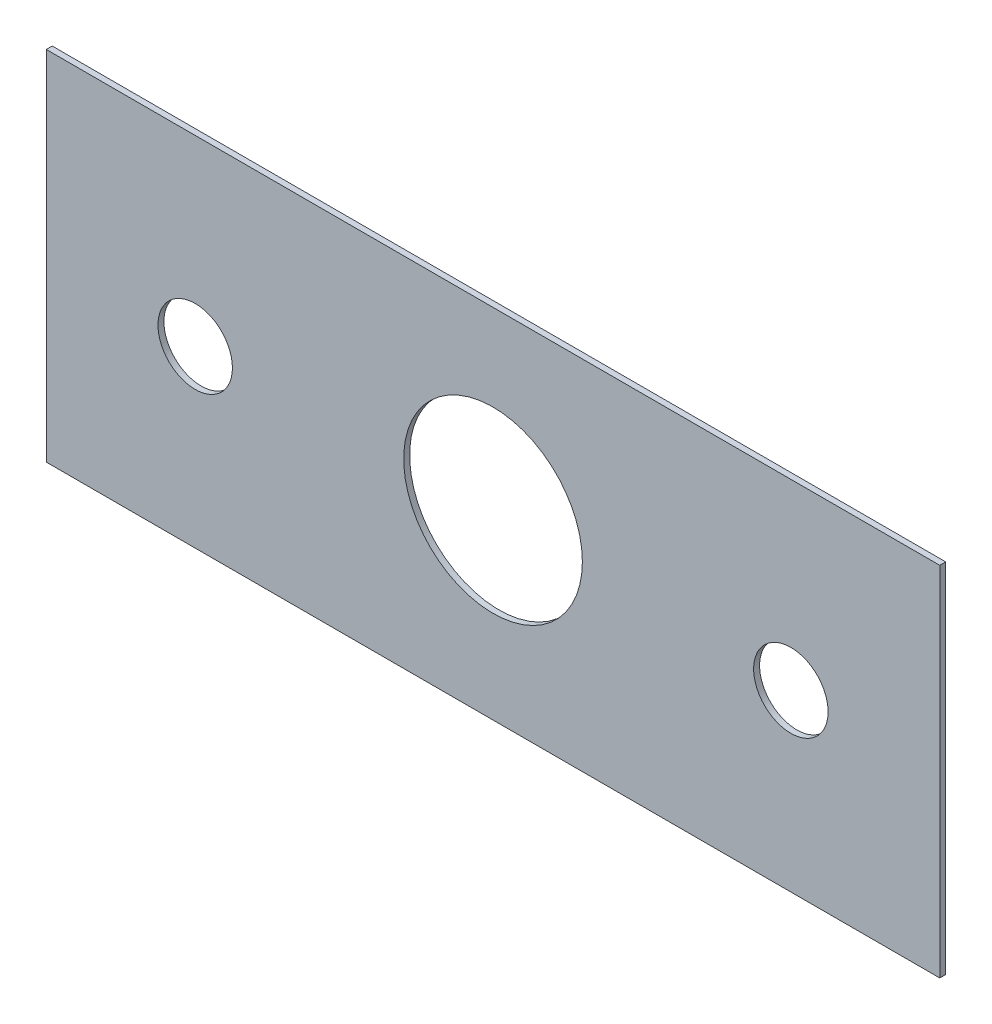
ISO-10303-21;
HEADER;
FILE_DESCRIPTION(('STEP AP214'),'2;1');
FILE_NAME('part.step','',(''),(''),'','','');
FILE_SCHEMA(('AUTOMOTIVE_DESIGN { 1 0 10303 214 1 1 1 1 }'));
ENDSEC;
DATA;
#1=APPLICATION_CONTEXT('core data for automotive mechanical design processes');
#2=APPLICATION_PROTOCOL_DEFINITION('international standard','automotive_design',2000,#1);
#3=PRODUCT_CONTEXT('',#1,'mechanical');
#4=PRODUCT('Part','Part','',(#3));
#5=PRODUCT_RELATED_PRODUCT_CATEGORY('part','',(#4));
#6=PRODUCT_DEFINITION_FORMATION('','',#4);
#7=PRODUCT_DEFINITION_CONTEXT('part definition',#1,'design');
#8=PRODUCT_DEFINITION('design','',#6,#7);
#9=PRODUCT_DEFINITION_SHAPE('','',#8);
#10=(LENGTH_UNIT() NAMED_UNIT(*) SI_UNIT(.MILLI.,.METRE.));
#11=(NAMED_UNIT(*) PLANE_ANGLE_UNIT() SI_UNIT($,.RADIAN.));
#12=(NAMED_UNIT(*) SI_UNIT($,.STERADIAN.) SOLID_ANGLE_UNIT());
#13=UNCERTAINTY_MEASURE_WITH_UNIT(LENGTH_MEASURE(1.E-05),#10,'distance_accuracy_value','');
#14=(GEOMETRIC_REPRESENTATION_CONTEXT(3) GLOBAL_UNCERTAINTY_ASSIGNED_CONTEXT((#13)) GLOBAL_UNIT_ASSIGNED_CONTEXT((#10,
#11,#12)) REPRESENTATION_CONTEXT('',''));
#15=CARTESIAN_POINT('',(0.,0.,0.));
#16=DIRECTION('',(0.,0.,1.));
#17=DIRECTION('',(1.,0.,0.));
#18=AXIS2_PLACEMENT_3D('',#15,#16,#17);
#19=CARTESIAN_POINT('',(0.,0.,1.));
#20=DIRECTION('',(-1.,0.,0.));
#21=DIRECTION('',(0.,0.,1.));
#22=AXIS2_PLACEMENT_3D('',#19,#20,#21);
#23=PLANE('',#22);
#24=DIRECTION('',(0.,1.,0.));
#25=VECTOR('',#24,1.);
#26=CARTESIAN_POINT('',(0.,0.,0.));
#27=LINE('',#26,#25);
#28=CARTESIAN_POINT('',(0.,0.,0.));
#29=VERTEX_POINT('',#28);
#30=CARTESIAN_POINT('',(0.,60.,0.));
#31=VERTEX_POINT('',#30);
#32=EDGE_CURVE('E96',#29,#31,#27,.T.);
#33=ORIENTED_EDGE('',*,*,#32,.T.);
#34=DIRECTION('',(0.,0.,-1.));
#35=VECTOR('',#34,1.);
#36=CARTESIAN_POINT('',(0.,60.,1.));
#37=LINE('',#36,#35);
#38=CARTESIAN_POINT('',(0.,60.,1.));
#39=VERTEX_POINT('',#38);
#40=EDGE_CURVE('E11',#39,#31,#37,.T.);
#41=ORIENTED_EDGE('',*,*,#40,.F.);
#42=DIRECTION('',(0.,1.,0.));
#43=VECTOR('',#42,1.);
#44=CARTESIAN_POINT('',(0.,0.,1.));
#45=LINE('',#44,#43);
#46=CARTESIAN_POINT('',(0.,0.,1.));
#47=VERTEX_POINT('',#46);
#48=EDGE_CURVE('E84',#47,#39,#45,.T.);
#49=ORIENTED_EDGE('',*,*,#48,.F.);
#50=DIRECTION('',(0.,0.,-1.));
#51=VECTOR('',#50,1.);
#52=CARTESIAN_POINT('',(0.,0.,1.));
#53=LINE('',#52,#51);
#54=EDGE_CURVE('E92',#47,#29,#53,.T.);
#55=ORIENTED_EDGE('',*,*,#54,.T.);
#56=EDGE_LOOP('',(#33,#41,#49,#55));
#57=FACE_BOUND('',#56,.T.);
#58=ADVANCED_FACE('F33',(#57),#23,.F.);
#59=CARTESIAN_POINT('',(0.,60.,1.));
#60=DIRECTION('',(0.,-1.,0.));
#61=DIRECTION('',(1.,0.,0.));
#62=AXIS2_PLACEMENT_3D('',#59,#60,#61);
#63=PLANE('',#62);
#64=DIRECTION('',(-1.,0.,0.));
#65=VECTOR('',#64,1.);
#66=CARTESIAN_POINT('',(0.,60.,0.));
#67=LINE('',#66,#65);
#68=CARTESIAN_POINT('',(-150.,60.,0.));
#69=VERTEX_POINT('',#68);
#70=EDGE_CURVE('E88',#31,#69,#67,.T.);
#71=ORIENTED_EDGE('',*,*,#70,.T.);
#72=DIRECTION('',(0.,0.,-1.));
#73=VECTOR('',#72,1.);
#74=CARTESIAN_POINT('',(-150.,60.,1.));
#75=LINE('',#74,#73);
#76=CARTESIAN_POINT('',(-150.,60.,1.));
#77=VERTEX_POINT('',#76);
#78=EDGE_CURVE('E41',#77,#69,#75,.T.);
#79=ORIENTED_EDGE('',*,*,#78,.F.);
#80=DIRECTION('',(-1.,0.,0.));
#81=VECTOR('',#80,1.);
#82=CARTESIAN_POINT('',(0.,60.,1.));
#83=LINE('',#82,#81);
#84=EDGE_CURVE('E79',#39,#77,#83,.T.);
#85=ORIENTED_EDGE('',*,*,#84,.F.);
#86=ORIENTED_EDGE('',*,*,#40,.T.);
#87=EDGE_LOOP('',(#71,#79,#85,#86));
#88=FACE_BOUND('',#87,.T.);
#89=ADVANCED_FACE('F87',(#88),#63,.F.);
#90=CARTESIAN_POINT('',(-150.,0.,1.));
#91=DIRECTION('',(1.,0.,0.));
#92=DIRECTION('',(0.,0.,-1.));
#93=AXIS2_PLACEMENT_3D('',#90,#91,#92);
#94=PLANE('',#93);
#95=DIRECTION('',(0.,-1.,0.));
#96=VECTOR('',#95,1.);
#97=CARTESIAN_POINT('',(-150.,0.,0.));
#98=LINE('',#97,#96);
#99=CARTESIAN_POINT('',(-150.,0.,0.));
#100=VERTEX_POINT('',#99);
#101=EDGE_CURVE('E66',#69,#100,#98,.T.);
#102=ORIENTED_EDGE('',*,*,#101,.T.);
#103=DIRECTION('',(0.,0.,-1.));
#104=VECTOR('',#103,1.);
#105=CARTESIAN_POINT('',(-150.,0.,1.));
#106=LINE('',#105,#104);
#107=CARTESIAN_POINT('',(-150.,0.,1.));
#108=VERTEX_POINT('',#107);
#109=EDGE_CURVE('E89',#108,#100,#106,.T.);
#110=ORIENTED_EDGE('',*,*,#109,.F.);
#111=DIRECTION('',(0.,-1.,0.));
#112=VECTOR('',#111,1.);
#113=CARTESIAN_POINT('',(-150.,0.,1.));
#114=LINE('',#113,#112);
#115=EDGE_CURVE('E82',#77,#108,#114,.T.);
#116=ORIENTED_EDGE('',*,*,#115,.F.);
#117=ORIENTED_EDGE('',*,*,#78,.T.);
#118=EDGE_LOOP('',(#102,#110,#116,#117));
#119=FACE_BOUND('',#118,.T.);
#120=ADVANCED_FACE('F90',(#119),#94,.F.);
#121=CARTESIAN_POINT('',(0.,0.,1.));
#122=DIRECTION('',(0.,1.,0.));
#123=DIRECTION('',(0.,0.,1.));
#124=AXIS2_PLACEMENT_3D('',#121,#122,#123);
#125=PLANE('',#124);
#126=DIRECTION('',(1.,0.,0.));
#127=VECTOR('',#126,1.);
#128=CARTESIAN_POINT('',(0.,0.,0.));
#129=LINE('',#128,#127);
#130=EDGE_CURVE('E72',#100,#29,#129,.T.);
#131=ORIENTED_EDGE('',*,*,#130,.T.);
#132=ORIENTED_EDGE('',*,*,#54,.F.);
#133=DIRECTION('',(1.,0.,0.));
#134=VECTOR('',#133,1.);
#135=CARTESIAN_POINT('',(0.,0.,1.));
#136=LINE('',#135,#134);
#137=EDGE_CURVE('E49',#108,#47,#136,.T.);
#138=ORIENTED_EDGE('',*,*,#137,.F.);
#139=ORIENTED_EDGE('',*,*,#109,.T.);
#140=EDGE_LOOP('',(#131,#132,#138,#139));
#141=FACE_BOUND('',#140,.T.);
#142=ADVANCED_FACE('F104',(#141),#125,.F.);
#143=CARTESIAN_POINT('',(0.,0.,1.));
#144=DIRECTION('',(0.,0.,1.));
#145=DIRECTION('',(1.,0.,0.));
#146=AXIS2_PLACEMENT_3D('',#143,#144,#145);
#147=PLANE('',#146);
#148=CARTESIAN_POINT('',(-125.,29.3187720056128,1.));
#149=DIRECTION('',(0.,0.,1.));
#150=DIRECTION('',(1.,0.,0.));
#151=AXIS2_PLACEMENT_3D('',#148,#149,#150);
#152=CIRCLE('',#151,6.25);
#153=CARTESIAN_POINT('',(-118.75,29.3187720056128,1.));
#154=VERTEX_POINT('',#153);
#155=EDGE_CURVE('E122',#154,#154,#152,.T.);
#156=ORIENTED_EDGE('',*,*,#155,.F.);
#157=EDGE_LOOP('',(#156));
#158=FACE_BOUND('',#157,.T.);
#159=CARTESIAN_POINT('',(-25.,29.3187720056128,1.));
#160=DIRECTION('',(0.,0.,1.));
#161=DIRECTION('',(1.,0.,0.));
#162=AXIS2_PLACEMENT_3D('',#159,#160,#161);
#163=CIRCLE('',#162,6.25);
#164=CARTESIAN_POINT('',(-18.75,29.3187720056128,1.));
#165=VERTEX_POINT('',#164);
#166=EDGE_CURVE('E116',#165,#165,#163,.T.);
#167=ORIENTED_EDGE('',*,*,#166,.F.);
#168=EDGE_LOOP('',(#167));
#169=FACE_BOUND('',#168,.T.);
#170=CARTESIAN_POINT('',(-75.,30.5109209957904,1.));
#171=DIRECTION('',(0.,0.,1.));
#172=DIRECTION('',(1.,0.,0.));
#173=AXIS2_PLACEMENT_3D('',#170,#171,#172);
#174=CIRCLE('',#173,15.);
#175=CARTESIAN_POINT('',(-60.,30.5109209957904,1.));
#176=VERTEX_POINT('',#175);
#177=EDGE_CURVE('E110',#176,#176,#174,.T.);
#178=ORIENTED_EDGE('',*,*,#177,.F.);
#179=EDGE_LOOP('',(#178));
#180=FACE_BOUND('',#179,.T.);
#181=ORIENTED_EDGE('',*,*,#48,.T.);
#182=ORIENTED_EDGE('',*,*,#84,.T.);
#183=ORIENTED_EDGE('',*,*,#115,.T.);
#184=ORIENTED_EDGE('',*,*,#137,.T.);
#185=EDGE_LOOP('',(#181,#182,#183,#184));
#186=FACE_BOUND('',#185,.T.);
#187=ADVANCED_FACE('F80',(#158,#169,#180,#186),#147,.T.);
#188=CARTESIAN_POINT('',(0.,0.,0.));
#189=DIRECTION('',(0.,0.,1.));
#190=DIRECTION('',(1.,0.,0.));
#191=AXIS2_PLACEMENT_3D('',#188,#189,#190);
#192=PLANE('',#191);
#193=CARTESIAN_POINT('',(-125.,29.3187720056128,0.));
#194=DIRECTION('',(0.,0.,1.));
#195=DIRECTION('',(1.,0.,0.));
#196=AXIS2_PLACEMENT_3D('',#193,#194,#195);
#197=CIRCLE('',#196,6.25);
#198=CARTESIAN_POINT('',(-118.75,29.3187720056128,0.));
#199=VERTEX_POINT('',#198);
#200=EDGE_CURVE('E113',#199,#199,#197,.T.);
#201=ORIENTED_EDGE('',*,*,#200,.T.);
#202=EDGE_LOOP('',(#201));
#203=FACE_BOUND('',#202,.T.);
#204=CARTESIAN_POINT('',(-25.,29.3187720056128,0.));
#205=DIRECTION('',(0.,0.,1.));
#206=DIRECTION('',(1.,0.,0.));
#207=AXIS2_PLACEMENT_3D('',#204,#205,#206);
#208=CIRCLE('',#207,6.25);
#209=CARTESIAN_POINT('',(-18.75,29.3187720056128,0.));
#210=VERTEX_POINT('',#209);
#211=EDGE_CURVE('E119',#210,#210,#208,.T.);
#212=ORIENTED_EDGE('',*,*,#211,.T.);
#213=EDGE_LOOP('',(#212));
#214=FACE_BOUND('',#213,.T.);
#215=CARTESIAN_POINT('',(-75.,30.5109209957904,0.));
#216=DIRECTION('',(0.,0.,1.));
#217=DIRECTION('',(1.,0.,0.));
#218=AXIS2_PLACEMENT_3D('',#215,#216,#217);
#219=CIRCLE('',#218,15.);
#220=CARTESIAN_POINT('',(-60.,30.5109209957904,0.));
#221=VERTEX_POINT('',#220);
#222=EDGE_CURVE('E99',#221,#221,#219,.T.);
#223=ORIENTED_EDGE('',*,*,#222,.T.);
#224=EDGE_LOOP('',(#223));
#225=FACE_BOUND('',#224,.T.);
#226=ORIENTED_EDGE('',*,*,#32,.F.);
#227=ORIENTED_EDGE('',*,*,#130,.F.);
#228=ORIENTED_EDGE('',*,*,#101,.F.);
#229=ORIENTED_EDGE('',*,*,#70,.F.);
#230=EDGE_LOOP('',(#226,#227,#228,#229));
#231=FACE_BOUND('',#230,.T.);
#232=ADVANCED_FACE('F107',(#203,#214,#225,#231),#192,.F.);
#233=CARTESIAN_POINT('',(-75.,30.5109209957904,0.));
#234=DIRECTION('',(0.,0.,1.));
#235=DIRECTION('',(1.,0.,0.));
#236=AXIS2_PLACEMENT_3D('',#233,#234,#235);
#237=CYLINDRICAL_SURFACE('',#236,15.);
#238=ORIENTED_EDGE('',*,*,#222,.F.);
#239=EDGE_LOOP('',(#238));
#240=FACE_BOUND('',#239,.T.);
#241=ORIENTED_EDGE('',*,*,#177,.T.);
#242=EDGE_LOOP('',(#241));
#243=FACE_BOUND('',#242,.T.);
#244=ADVANCED_FACE('F144',(#240,#243),#237,.F.);
#245=CARTESIAN_POINT('',(-25.,29.3187720056128,0.));
#246=DIRECTION('',(0.,0.,1.));
#247=DIRECTION('',(1.,0.,0.));
#248=AXIS2_PLACEMENT_3D('',#245,#246,#247);
#249=CYLINDRICAL_SURFACE('',#248,6.25);
#250=ORIENTED_EDGE('',*,*,#211,.F.);
#251=EDGE_LOOP('',(#250));
#252=FACE_BOUND('',#251,.T.);
#253=ORIENTED_EDGE('',*,*,#166,.T.);
#254=EDGE_LOOP('',(#253));
#255=FACE_BOUND('',#254,.T.);
#256=ADVANCED_FACE('F133',(#252,#255),#249,.F.);
#257=CARTESIAN_POINT('',(-125.,29.3187720056128,0.));
#258=DIRECTION('',(0.,0.,1.));
#259=DIRECTION('',(1.,0.,0.));
#260=AXIS2_PLACEMENT_3D('',#257,#258,#259);
#261=CYLINDRICAL_SURFACE('',#260,6.25);
#262=ORIENTED_EDGE('',*,*,#200,.F.);
#263=EDGE_LOOP('',(#262));
#264=FACE_BOUND('',#263,.T.);
#265=ORIENTED_EDGE('',*,*,#155,.T.);
#266=EDGE_LOOP('',(#265));
#267=FACE_BOUND('',#266,.T.);
#268=ADVANCED_FACE('F130',(#264,#267),#261,.F.);
#269=CLOSED_SHELL('',(#58,#89,#120,#142,#187,#232,#244,#256,#268));
#270=MANIFOLD_SOLID_BREP('B2',#269);
#271=ADVANCED_BREP_SHAPE_REPRESENTATION('',(#18,#270),#14);
#272=SHAPE_DEFINITION_REPRESENTATION(#9,#271);
ENDSEC;
END-ISO-10303-21;
